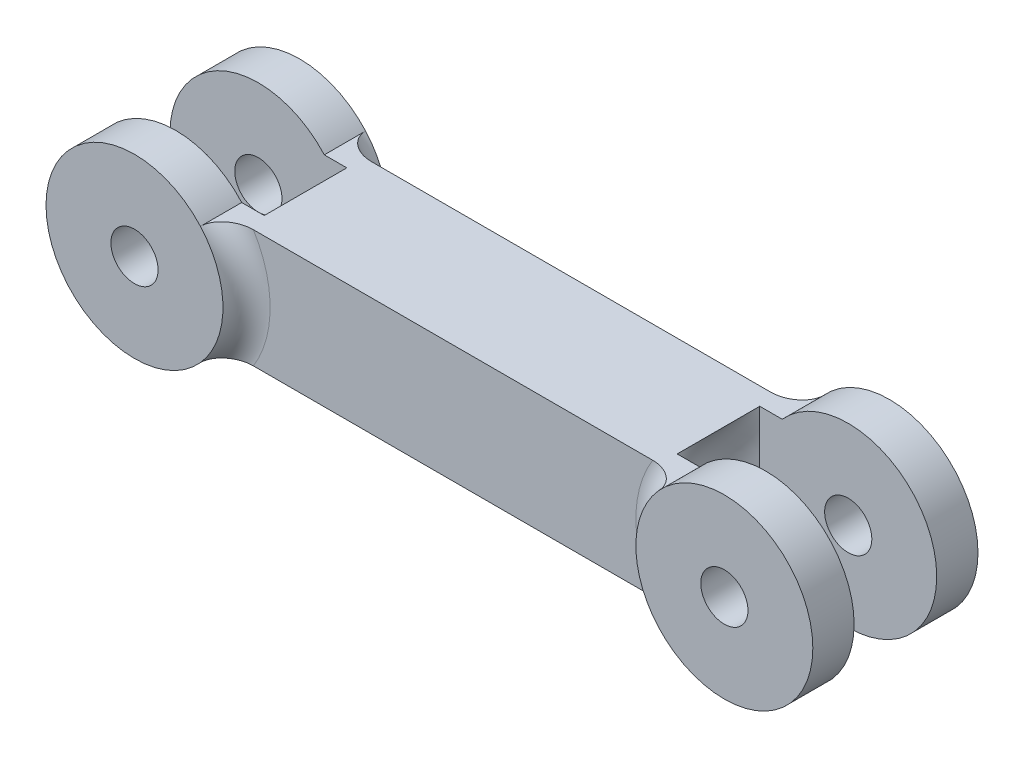
ISO-10303-21;
HEADER;
FILE_DESCRIPTION(('STEP AP214'),'2;1');
FILE_NAME('part.step','',(''),(''),'','','');
FILE_SCHEMA(('AUTOMOTIVE_DESIGN { 1 0 10303 214 1 1 1 1 }'));
ENDSEC;
DATA;
#1=APPLICATION_CONTEXT('core data for automotive mechanical design processes');
#2=APPLICATION_PROTOCOL_DEFINITION('international standard','automotive_design',2000,#1);
#3=PRODUCT_CONTEXT('',#1,'mechanical');
#4=PRODUCT('Part','Part','',(#3));
#5=PRODUCT_RELATED_PRODUCT_CATEGORY('part','',(#4));
#6=PRODUCT_DEFINITION_FORMATION('','',#4);
#7=PRODUCT_DEFINITION_CONTEXT('part definition',#1,'design');
#8=PRODUCT_DEFINITION('design','',#6,#7);
#9=PRODUCT_DEFINITION_SHAPE('','',#8);
#10=(LENGTH_UNIT() NAMED_UNIT(*) SI_UNIT(.MILLI.,.METRE.));
#11=(NAMED_UNIT(*) PLANE_ANGLE_UNIT() SI_UNIT($,.RADIAN.));
#12=(NAMED_UNIT(*) SI_UNIT($,.STERADIAN.) SOLID_ANGLE_UNIT());
#13=UNCERTAINTY_MEASURE_WITH_UNIT(LENGTH_MEASURE(1.E-05),#10,'distance_accuracy_value','');
#14=(GEOMETRIC_REPRESENTATION_CONTEXT(3) GLOBAL_UNCERTAINTY_ASSIGNED_CONTEXT((#13)) GLOBAL_UNIT_ASSIGNED_CONTEXT((#10,
#11,#12)) REPRESENTATION_CONTEXT('',''));
#15=CARTESIAN_POINT('',(0.,0.,0.));
#16=DIRECTION('',(0.,0.,1.));
#17=DIRECTION('',(1.,0.,0.));
#18=AXIS2_PLACEMENT_3D('',#15,#16,#17);
#19=CARTESIAN_POINT('',(12.5,0.,3.5));
#20=DIRECTION('',(0.,0.,-1.));
#21=DIRECTION('',(-1.,0.,0.));
#22=AXIS2_PLACEMENT_3D('',#19,#20,#21);
#23=CYLINDRICAL_SURFACE('',#22,3.75);
#24=DIRECTION('',(0.,0.,-1.));
#25=VECTOR('',#24,1.);
#26=CARTESIAN_POINT('',(9.70491502812526,-2.5,3.5));
#27=LINE('',#26,#25);
#28=CARTESIAN_POINT('',(9.70491502812526,-2.5,-1.75));
#29=VERTEX_POINT('',#28);
#30=CARTESIAN_POINT('',(9.70491502812526,-2.5,-3.5));
#31=VERTEX_POINT('',#30);
#32=EDGE_CURVE('E127',#29,#31,#27,.T.);
#33=ORIENTED_EDGE('',*,*,#32,.T.);
#34=CARTESIAN_POINT('',(12.5,0.,-3.5));
#35=DIRECTION('',(0.,0.,1.));
#36=DIRECTION('',(1.,0.,0.));
#37=AXIS2_PLACEMENT_3D('',#34,#35,#36);
#38=CIRCLE('',#37,3.75);
#39=CARTESIAN_POINT('',(9.70491502812526,2.5,-3.5));
#40=VERTEX_POINT('',#39);
#41=EDGE_CURVE('E192',#31,#40,#38,.T.);
#42=ORIENTED_EDGE('',*,*,#41,.T.);
#43=DIRECTION('',(0.,0.,-1.));
#44=VECTOR('',#43,1.);
#45=CARTESIAN_POINT('',(9.70491502812526,2.5,3.5));
#46=LINE('',#45,#44);
#47=CARTESIAN_POINT('',(9.70491502812526,2.5,-1.75));
#48=VERTEX_POINT('',#47);
#49=EDGE_CURVE('E204',#40,#48,#46,.F.);
#50=ORIENTED_EDGE('',*,*,#49,.T.);
#51=CARTESIAN_POINT('',(12.5,0.,-1.75));
#52=DIRECTION('',(0.,0.,-1.));
#53=DIRECTION('',(-1.,0.,0.));
#54=AXIS2_PLACEMENT_3D('',#51,#52,#53);
#55=CIRCLE('',#54,3.75);
#56=EDGE_CURVE('E128',#48,#29,#55,.T.);
#57=ORIENTED_EDGE('',*,*,#56,.T.);
#58=EDGE_LOOP('',(#33,#42,#50,#57));
#59=FACE_BOUND('',#58,.T.);
#60=ADVANCED_FACE('F49',(#59),#23,.T.);
#61=CARTESIAN_POINT('',(-12.5,0.,3.5));
#62=DIRECTION('',(0.,0.,-1.));
#63=DIRECTION('',(-1.,0.,0.));
#64=AXIS2_PLACEMENT_3D('',#61,#62,#63);
#65=CYLINDRICAL_SURFACE('',#64,3.75);
#66=CARTESIAN_POINT('',(-12.5,0.,3.5));
#67=DIRECTION('',(0.,0.,1.));
#68=DIRECTION('',(1.,0.,0.));
#69=AXIS2_PLACEMENT_3D('',#66,#67,#68);
#70=CIRCLE('',#69,3.75);
#71=CARTESIAN_POINT('',(-9.70491502812526,2.5,3.5));
#72=VERTEX_POINT('',#71);
#73=CARTESIAN_POINT('',(-9.70491502812526,-2.5,3.5));
#74=VERTEX_POINT('',#73);
#75=EDGE_CURVE('E178',#72,#74,#70,.T.);
#76=ORIENTED_EDGE('',*,*,#75,.F.);
#77=DIRECTION('',(0.,0.,-1.));
#78=VECTOR('',#77,1.);
#79=CARTESIAN_POINT('',(-9.70491502812526,2.5,3.5));
#80=LINE('',#79,#78);
#81=CARTESIAN_POINT('',(-9.70491502812526,2.5,1.75));
#82=VERTEX_POINT('',#81);
#83=EDGE_CURVE('E189',#72,#82,#80,.T.);
#84=ORIENTED_EDGE('',*,*,#83,.T.);
#85=CARTESIAN_POINT('',(-12.5,0.,1.75));
#86=DIRECTION('',(0.,0.,1.));
#87=DIRECTION('',(1.,0.,0.));
#88=AXIS2_PLACEMENT_3D('',#85,#86,#87);
#89=CIRCLE('',#88,3.75);
#90=CARTESIAN_POINT('',(-9.70491502812526,-2.5,1.75));
#91=VERTEX_POINT('',#90);
#92=EDGE_CURVE('E155',#82,#91,#89,.T.);
#93=ORIENTED_EDGE('',*,*,#92,.T.);
#94=DIRECTION('',(0.,0.,-1.));
#95=VECTOR('',#94,1.);
#96=CARTESIAN_POINT('',(-9.70491502812526,-2.5,3.5));
#97=LINE('',#96,#95);
#98=EDGE_CURVE('E70',#91,#74,#97,.F.);
#99=ORIENTED_EDGE('',*,*,#98,.T.);
#100=EDGE_LOOP('',(#76,#84,#93,#99));
#101=FACE_BOUND('',#100,.T.);
#102=ADVANCED_FACE('F339',(#101),#65,.T.);
#103=CARTESIAN_POINT('',(-12.5,0.,-3.5));
#104=DIRECTION('',(0.,0.,1.));
#105=DIRECTION('',(1.,0.,0.));
#106=AXIS2_PLACEMENT_3D('',#103,#104,#105);
#107=CYLINDRICAL_SURFACE('',#106,1.);
#108=CARTESIAN_POINT('',(-12.5,0.,1.75));
#109=DIRECTION('',(0.,0.,1.));
#110=DIRECTION('',(1.,0.,0.));
#111=AXIS2_PLACEMENT_3D('',#108,#109,#110);
#112=CIRCLE('',#111,1.);
#113=CARTESIAN_POINT('',(-11.5,0.,1.75));
#114=VERTEX_POINT('',#113);
#115=EDGE_CURVE('E154',#114,#114,#112,.F.);
#116=ORIENTED_EDGE('',*,*,#115,.T.);
#117=EDGE_LOOP('',(#116));
#118=FACE_BOUND('',#117,.T.);
#119=CARTESIAN_POINT('',(-12.5,0.,3.5));
#120=DIRECTION('',(0.,0.,1.));
#121=DIRECTION('',(1.,0.,0.));
#122=AXIS2_PLACEMENT_3D('',#119,#120,#121);
#123=CIRCLE('',#122,1.);
#124=CARTESIAN_POINT('',(-11.5,0.,3.5));
#125=VERTEX_POINT('',#124);
#126=EDGE_CURVE('E168',#125,#125,#123,.T.);
#127=ORIENTED_EDGE('',*,*,#126,.T.);
#128=EDGE_LOOP('',(#127));
#129=FACE_BOUND('',#128,.T.);
#130=ADVANCED_FACE('F346',(#118,#129),#107,.F.);
#131=CARTESIAN_POINT('',(12.5,0.,-3.5));
#132=DIRECTION('',(0.,0.,1.));
#133=DIRECTION('',(1.,0.,0.));
#134=AXIS2_PLACEMENT_3D('',#131,#132,#133);
#135=CYLINDRICAL_SURFACE('',#134,1.);
#136=CARTESIAN_POINT('',(12.5,0.,1.75));
#137=DIRECTION('',(0.,0.,1.));
#138=DIRECTION('',(1.,0.,0.));
#139=AXIS2_PLACEMENT_3D('',#136,#137,#138);
#140=CIRCLE('',#139,1.);
#141=CARTESIAN_POINT('',(13.5,0.,1.75));
#142=VERTEX_POINT('',#141);
#143=EDGE_CURVE('E130',#142,#142,#140,.F.);
#144=ORIENTED_EDGE('',*,*,#143,.T.);
#145=EDGE_LOOP('',(#144));
#146=FACE_BOUND('',#145,.T.);
#147=CARTESIAN_POINT('',(12.5,0.,3.5));
#148=DIRECTION('',(0.,0.,1.));
#149=DIRECTION('',(1.,0.,0.));
#150=AXIS2_PLACEMENT_3D('',#147,#148,#149);
#151=CIRCLE('',#150,1.);
#152=CARTESIAN_POINT('',(13.5,0.,3.5));
#153=VERTEX_POINT('',#152);
#154=EDGE_CURVE('E174',#153,#153,#151,.T.);
#155=ORIENTED_EDGE('',*,*,#154,.T.);
#156=EDGE_LOOP('',(#155));
#157=FACE_BOUND('',#156,.T.);
#158=ADVANCED_FACE('F482',(#146,#157),#135,.F.);
#159=CARTESIAN_POINT('',(-12.5,2.5,2.5));
#160=DIRECTION('',(0.,-1.,0.));
#161=DIRECTION('',(0.,0.,-1.));
#162=AXIS2_PLACEMENT_3D('',#159,#160,#161);
#163=PLANE('',#162);
#164=DIRECTION('',(0.,0.,1.));
#165=VECTOR('',#164,1.);
#166=CARTESIAN_POINT('',(-8.75,2.5,2.5));
#167=LINE('',#166,#165);
#168=CARTESIAN_POINT('',(-8.75,2.5,-1.75));
#169=VERTEX_POINT('',#168);
#170=CARTESIAN_POINT('',(-8.75,2.5,1.75));
#171=VERTEX_POINT('',#170);
#172=EDGE_CURVE('E177',#169,#171,#167,.T.);
#173=ORIENTED_EDGE('',*,*,#172,.T.);
#174=DIRECTION('',(-1.,0.,0.));
#175=VECTOR('',#174,1.);
#176=CARTESIAN_POINT('',(-12.5,2.5,1.75));
#177=LINE('',#176,#175);
#178=EDGE_CURVE('E160',#171,#82,#177,.T.);
#179=ORIENTED_EDGE('',*,*,#178,.T.);
#180=ORIENTED_EDGE('',*,*,#83,.F.);
#181=CARTESIAN_POINT('',(-9.70491502812526,2.5,3.5));
#182=CARTESIAN_POINT('',(-9.7049200725292,2.5,3.47644730100022));
#183=CARTESIAN_POINT('',(-9.70379770234874,2.5,3.45290917372818));
#184=CARTESIAN_POINT('',(-9.69935465653177,2.5,3.40606053403174));
#185=CARTESIAN_POINT('',(-9.69603581450327,2.5,3.38274984819653));
#186=CARTESIAN_POINT('',(-9.68294941285069,2.5,3.31383452382514));
#187=CARTESIAN_POINT('',(-9.67004959038108,2.5,3.26879466332894));
#188=CARTESIAN_POINT('',(-9.63693837940047,2.5,3.18172089404509));
#189=CARTESIAN_POINT('',(-9.61674904959208,2.5,3.13967836983396));
#190=CARTESIAN_POINT('',(-9.57024570996258,2.5,3.05903705578245));
#191=CARTESIAN_POINT('',(-9.54391622872179,2.5,3.02044731159249));
#192=CARTESIAN_POINT('',(-9.4751120244116,2.5,2.93292601600958));
#193=CARTESIAN_POINT('',(-9.43033891954086,2.5,2.88580145921302));
#194=CARTESIAN_POINT('',(-9.33377526194016,2.5,2.7994301368489));
#195=CARTESIAN_POINT('',(-9.28197600984906,2.5,2.7601932892686));
#196=CARTESIAN_POINT('',(-9.17230729582027,2.5,2.68914182985251));
#197=CARTESIAN_POINT('',(-9.11435070175242,2.5,2.65746252677132));
#198=CARTESIAN_POINT('',(-8.99462708060846,2.5,2.60254570651114));
#199=CARTESIAN_POINT('',(-8.93286188766615,2.5,2.57930416247449));
#200=CARTESIAN_POINT('',(-8.80361932096866,2.5,2.54053482631346));
#201=CARTESIAN_POINT('',(-8.7360104502717,2.5,2.52544364825104));
#202=CARTESIAN_POINT('',(-8.59932072305916,2.5,2.50518057644539));
#203=CARTESIAN_POINT('',(-8.53023973607571,2.5,2.50000956561532));
#204=CARTESIAN_POINT('',(-8.46112639464912,2.5,2.5));
#205=B_SPLINE_CURVE_WITH_KNOTS('',3,(#181,#182,#183,#184,#185,#186,#187,#188,#189,#190,#191,
#192,#193,#194,#195,#196,#197,#198,#199,#200,#201,#202,#203,#204),.UNSPECIFIED.,.F.,.F.,(4,2,2,
2,2,2,2,2,2,2,2,4),(0.,0.0706039500021436,0.141149034261344,0.280904415255709,0.420240380571201,
0.559931300120389,0.753894629336221,0.94810034275378,1.14555851100565,1.34292231955389,
1.5500129632788,1.75712203759743),.UNSPECIFIED.);
#206=CARTESIAN_POINT('',(-8.46112639464912,2.5,2.5));
#207=VERTEX_POINT('',#206);
#208=EDGE_CURVE('E61',#72,#207,#205,.T.);
#209=ORIENTED_EDGE('',*,*,#208,.T.);
#210=DIRECTION('',(-1.,0.,0.));
#211=VECTOR('',#210,1.);
#212=CARTESIAN_POINT('',(-12.5,2.5,2.5));
#213=LINE('',#212,#211);
#214=CARTESIAN_POINT('',(8.46112639464912,2.5,2.5));
#215=VERTEX_POINT('',#214);
#216=EDGE_CURVE('E208',#215,#207,#213,.T.);
#217=ORIENTED_EDGE('',*,*,#216,.F.);
#218=CARTESIAN_POINT('',(8.46112639464912,2.5,2.5));
#219=CARTESIAN_POINT('',(8.54611014179282,2.5,2.50002523424209));
#220=CARTESIAN_POINT('',(8.63104836721201,2.5,2.50783483651043));
#221=CARTESIAN_POINT('',(8.79860407903754,2.5,2.53838944765819));
#222=CARTESIAN_POINT('',(8.88120917542409,2.5,2.56120259774959));
#223=CARTESIAN_POINT('',(9.03633380801774,2.5,2.61935263187054));
#224=CARTESIAN_POINT('',(9.10916082110134,2.5,2.65387221392362));
#225=CARTESIAN_POINT('',(9.2475113940083,2.5,2.73522668310348));
#226=CARTESIAN_POINT('',(9.31305101407,2.5,2.78203369291169));
#227=CARTESIAN_POINT('',(9.41593492282529,2.5,2.87224432633347));
#228=CARTESIAN_POINT('',(9.45592169672022,2.5,2.91264513788035));
#229=CARTESIAN_POINT('',(9.52897354659569,2.5,2.99930876400299));
#230=CARTESIAN_POINT('',(9.56204774586768,2.5,3.04556372101491));
#231=CARTESIAN_POINT('',(9.61396603862031,2.5,3.13431165020416));
#232=CARTESIAN_POINT('',(9.63430957398898,2.5,3.17592521856731));
#233=CARTESIAN_POINT('',(9.66780244728371,2.5,3.26192459797803));
#234=CARTESIAN_POINT('',(9.68096756829799,2.5,3.306304086085));
#235=CARTESIAN_POINT('',(9.69496332500858,2.5,3.37589627639452));
#236=CARTESIAN_POINT('',(9.69868188505814,2.5,3.40055343305325));
#237=CARTESIAN_POINT('',(9.70366231230621,2.5,3.45013478340853));
#238=CARTESIAN_POINT('',(9.70492210894404,2.5,3.47505918441327));
#239=CARTESIAN_POINT('',(9.70491502812526,2.5,3.5));
#240=B_SPLINE_CURVE_WITH_KNOTS('',3,(#218,#219,#220,#221,#222,#223,#224,#225,#226,#227,#228,
#229,#230,#231,#232,#233,#234,#235,#236,#237,#238,#239),.UNSPECIFIED.,.F.,.F.,(4,2,2,2,2,2,2,2,
2,2,4),(0.,0.254556907092154,0.510277987085597,0.75092851467693,0.991037711216968,
1.16097838251742,1.33069332780772,1.46910913779057,1.60721937475569,1.68191662716488,
1.75667675612865),.UNSPECIFIED.);
#241=CARTESIAN_POINT('',(9.70491502812526,2.5,3.5));
#242=VERTEX_POINT('',#241);
#243=EDGE_CURVE('E248',#215,#242,#240,.T.);
#244=ORIENTED_EDGE('',*,*,#243,.T.);
#245=CARTESIAN_POINT('',(9.70491502812526,2.5,1.75));
#246=VERTEX_POINT('',#245);
#247=EDGE_CURVE('E203',#246,#242,#46,.F.);
#248=ORIENTED_EDGE('',*,*,#247,.F.);
#249=DIRECTION('',(-1.,0.,0.));
#250=VECTOR('',#249,1.);
#251=CARTESIAN_POINT('',(-12.5,2.5,1.75));
#252=LINE('',#251,#250);
#253=CARTESIAN_POINT('',(8.75,2.5,1.75));
#254=VERTEX_POINT('',#253);
#255=EDGE_CURVE('E139',#246,#254,#252,.T.);
#256=ORIENTED_EDGE('',*,*,#255,.T.);
#257=DIRECTION('',(0.,0.,-1.));
#258=VECTOR('',#257,1.);
#259=CARTESIAN_POINT('',(8.75,2.5,2.5));
#260=LINE('',#259,#258);
#261=CARTESIAN_POINT('',(8.75,2.5,-1.75));
#262=VERTEX_POINT('',#261);
#263=EDGE_CURVE('E163',#254,#262,#260,.T.);
#264=ORIENTED_EDGE('',*,*,#263,.T.);
#265=DIRECTION('',(1.,0.,0.));
#266=VECTOR('',#265,1.);
#267=CARTESIAN_POINT('',(-12.5,2.5,-1.75));
#268=LINE('',#267,#266);
#269=EDGE_CURVE('E123',#262,#48,#268,.T.);
#270=ORIENTED_EDGE('',*,*,#269,.T.);
#271=ORIENTED_EDGE('',*,*,#49,.F.);
#272=CARTESIAN_POINT('',(9.70491502812526,2.5,-3.5));
#273=CARTESIAN_POINT('',(9.7049200725292,2.5,-3.47644730100022));
#274=CARTESIAN_POINT('',(9.70379770234874,2.5,-3.45290917372818));
#275=CARTESIAN_POINT('',(9.69935465653177,2.5,-3.40606053403174));
#276=CARTESIAN_POINT('',(9.69603581450327,2.5,-3.38274984819653));
#277=CARTESIAN_POINT('',(9.68294941285069,2.5,-3.31383452382514));
#278=CARTESIAN_POINT('',(9.67004959038108,2.5,-3.26879466332894));
#279=CARTESIAN_POINT('',(9.63693837940047,2.5,-3.18172089404509));
#280=CARTESIAN_POINT('',(9.61674904959208,2.5,-3.13967836983396));
#281=CARTESIAN_POINT('',(9.57024570996258,2.5,-3.05903705578245));
#282=CARTESIAN_POINT('',(9.54391622872179,2.5,-3.02044731159249));
#283=CARTESIAN_POINT('',(9.4751120244116,2.5,-2.93292601600958));
#284=CARTESIAN_POINT('',(9.43033891954086,2.5,-2.88580145921302));
#285=CARTESIAN_POINT('',(9.33377526194016,2.5,-2.7994301368489));
#286=CARTESIAN_POINT('',(9.28197600984906,2.5,-2.7601932892686));
#287=CARTESIAN_POINT('',(9.17230729582027,2.5,-2.68914182985251));
#288=CARTESIAN_POINT('',(9.11435070175242,2.5,-2.65746252677132));
#289=CARTESIAN_POINT('',(8.99462708060846,2.5,-2.60254570651114));
#290=CARTESIAN_POINT('',(8.93286188766615,2.5,-2.57930416247449));
#291=CARTESIAN_POINT('',(8.80361932096866,2.5,-2.54053482631346));
#292=CARTESIAN_POINT('',(8.7360104502717,2.5,-2.52544364825104));
#293=CARTESIAN_POINT('',(8.59932072305916,2.5,-2.50518057644539));
#294=CARTESIAN_POINT('',(8.53023973607571,2.5,-2.50000956561532));
#295=CARTESIAN_POINT('',(8.46112639464912,2.5,-2.5));
#296=B_SPLINE_CURVE_WITH_KNOTS('',3,(#272,#273,#274,#275,#276,#277,#278,#279,#280,#281,#282,
#283,#284,#285,#286,#287,#288,#289,#290,#291,#292,#293,#294,#295),.UNSPECIFIED.,.F.,.F.,(4,2,2,
2,2,2,2,2,2,2,2,4),(0.,0.0706039500021436,0.141149034261344,0.280904415255709,0.420240380571201,
0.559931300120389,0.753894629336221,0.94810034275378,1.14555851100565,1.34292231955389,
1.5500129632788,1.75712203759743),.UNSPECIFIED.);
#297=CARTESIAN_POINT('',(8.46112639464912,2.5,-2.5));
#298=VERTEX_POINT('',#297);
#299=EDGE_CURVE('E281',#40,#298,#296,.T.);
#300=ORIENTED_EDGE('',*,*,#299,.T.);
#301=DIRECTION('',(-1.,0.,0.));
#302=VECTOR('',#301,1.);
#303=CARTESIAN_POINT('',(-12.5,2.5,-2.5));
#304=LINE('',#303,#302);
#305=CARTESIAN_POINT('',(-8.46112639464912,2.5,-2.5));
#306=VERTEX_POINT('',#305);
#307=EDGE_CURVE('E207',#298,#306,#304,.T.);
#308=ORIENTED_EDGE('',*,*,#307,.T.);
#309=CARTESIAN_POINT('',(-8.46112639464912,2.5,-2.5));
#310=CARTESIAN_POINT('',(-8.54611014179282,2.5,-2.50002523424209));
#311=CARTESIAN_POINT('',(-8.63104836721201,2.5,-2.50783483651043));
#312=CARTESIAN_POINT('',(-8.79860407903754,2.5,-2.53838944765819));
#313=CARTESIAN_POINT('',(-8.88120917542409,2.5,-2.56120259774959));
#314=CARTESIAN_POINT('',(-9.03633380801774,2.5,-2.61935263187054));
#315=CARTESIAN_POINT('',(-9.10916082110134,2.5,-2.65387221392362));
#316=CARTESIAN_POINT('',(-9.2475113940083,2.5,-2.73522668310348));
#317=CARTESIAN_POINT('',(-9.31305101407,2.5,-2.78203369291169));
#318=CARTESIAN_POINT('',(-9.41593492282529,2.5,-2.87224432633347));
#319=CARTESIAN_POINT('',(-9.45592169672022,2.5,-2.91264513788035));
#320=CARTESIAN_POINT('',(-9.52897354659569,2.5,-2.99930876400299));
#321=CARTESIAN_POINT('',(-9.56204774586768,2.5,-3.04556372101491));
#322=CARTESIAN_POINT('',(-9.61396603862031,2.5,-3.13431165020416));
#323=CARTESIAN_POINT('',(-9.63430957398898,2.5,-3.17592521856731));
#324=CARTESIAN_POINT('',(-9.66780244728371,2.5,-3.26192459797803));
#325=CARTESIAN_POINT('',(-9.68096756829799,2.5,-3.306304086085));
#326=CARTESIAN_POINT('',(-9.69496332500858,2.5,-3.37589627639452));
#327=CARTESIAN_POINT('',(-9.69868188505814,2.5,-3.40055343305325));
#328=CARTESIAN_POINT('',(-9.70366231230621,2.5,-3.45013478340853));
#329=CARTESIAN_POINT('',(-9.70492210894404,2.5,-3.47505918441327));
#330=CARTESIAN_POINT('',(-9.70491502812526,2.5,-3.5));
#331=B_SPLINE_CURVE_WITH_KNOTS('',3,(#309,#310,#311,#312,#313,#314,#315,#316,#317,#318,#319,
#320,#321,#322,#323,#324,#325,#326,#327,#328,#329,#330),.UNSPECIFIED.,.F.,.F.,(4,2,2,2,2,2,2,2,
2,2,4),(0.,0.254556907092154,0.510277987085597,0.75092851467693,0.991037711216968,
1.16097838251742,1.33069332780772,1.46910913779057,1.60721937475569,1.68191662716488,
1.75667675612865),.UNSPECIFIED.);
#332=CARTESIAN_POINT('',(-9.70491502812526,2.5,-3.5));
#333=VERTEX_POINT('',#332);
#334=EDGE_CURVE('E288',#306,#333,#331,.T.);
#335=ORIENTED_EDGE('',*,*,#334,.T.);
#336=CARTESIAN_POINT('',(-9.70491502812526,2.5,-1.75));
#337=VERTEX_POINT('',#336);
#338=EDGE_CURVE('E188',#337,#333,#80,.T.);
#339=ORIENTED_EDGE('',*,*,#338,.F.);
#340=DIRECTION('',(1.,0.,0.));
#341=VECTOR('',#340,1.);
#342=CARTESIAN_POINT('',(-12.5,2.5,-1.75));
#343=LINE('',#342,#341);
#344=EDGE_CURVE('E148',#337,#169,#343,.T.);
#345=ORIENTED_EDGE('',*,*,#344,.T.);
#346=EDGE_LOOP('',(#173,#179,#180,#209,#217,#244,#248,#256,#264,#270,#271,#300,#308,#335,#339,#345));
#347=FACE_BOUND('',#346,.T.);
#348=ADVANCED_FACE('F264',(#347),#163,.F.);
#349=CARTESIAN_POINT('',(-12.5,-2.5,2.5));
#350=DIRECTION('',(0.,1.,0.));
#351=DIRECTION('',(0.,0.,1.));
#352=AXIS2_PLACEMENT_3D('',#349,#350,#351);
#353=PLANE('',#352);
#354=ORIENTED_EDGE('',*,*,#98,.F.);
#355=DIRECTION('',(1.,0.,0.));
#356=VECTOR('',#355,1.);
#357=CARTESIAN_POINT('',(-12.5,-2.5,1.75));
#358=LINE('',#357,#356);
#359=CARTESIAN_POINT('',(-8.75,-2.5,1.75));
#360=VERTEX_POINT('',#359);
#361=EDGE_CURVE('E157',#91,#360,#358,.T.);
#362=ORIENTED_EDGE('',*,*,#361,.T.);
#363=DIRECTION('',(0.,0.,-1.));
#364=VECTOR('',#363,1.);
#365=CARTESIAN_POINT('',(-8.75,-2.5,2.5));
#366=LINE('',#365,#364);
#367=CARTESIAN_POINT('',(-8.75,-2.5,-1.75));
#368=VERTEX_POINT('',#367);
#369=EDGE_CURVE('E113',#360,#368,#366,.T.);
#370=ORIENTED_EDGE('',*,*,#369,.T.);
#371=DIRECTION('',(-1.,0.,0.));
#372=VECTOR('',#371,1.);
#373=CARTESIAN_POINT('',(-12.5,-2.5,-1.75));
#374=LINE('',#373,#372);
#375=CARTESIAN_POINT('',(-9.70491502812526,-2.5,-1.75));
#376=VERTEX_POINT('',#375);
#377=EDGE_CURVE('E149',#368,#376,#374,.T.);
#378=ORIENTED_EDGE('',*,*,#377,.T.);
#379=CARTESIAN_POINT('',(-9.70491502812526,-2.5,-3.5));
#380=VERTEX_POINT('',#379);
#381=EDGE_CURVE('E185',#380,#376,#97,.F.);
#382=ORIENTED_EDGE('',*,*,#381,.F.);
#383=CARTESIAN_POINT('',(-9.70491502812526,-2.5,-3.5));
#384=CARTESIAN_POINT('',(-9.7049200725292,-2.5,-3.47644730100022));
#385=CARTESIAN_POINT('',(-9.70379770234874,-2.5,-3.45290917372818));
#386=CARTESIAN_POINT('',(-9.69935465653177,-2.5,-3.40606053403174));
#387=CARTESIAN_POINT('',(-9.69603581450327,-2.5,-3.38274984819653));
#388=CARTESIAN_POINT('',(-9.68294941285069,-2.5,-3.31383452382514));
#389=CARTESIAN_POINT('',(-9.67004959038108,-2.5,-3.26879466332894));
#390=CARTESIAN_POINT('',(-9.63693837940047,-2.5,-3.18172089404509));
#391=CARTESIAN_POINT('',(-9.61674904959208,-2.5,-3.13967836983396));
#392=CARTESIAN_POINT('',(-9.57024570996258,-2.5,-3.05903705578245));
#393=CARTESIAN_POINT('',(-9.54391622872179,-2.5,-3.02044731159249));
#394=CARTESIAN_POINT('',(-9.4751120244116,-2.5,-2.93292601600958));
#395=CARTESIAN_POINT('',(-9.43033891954086,-2.5,-2.88580145921302));
#396=CARTESIAN_POINT('',(-9.33377526194016,-2.5,-2.7994301368489));
#397=CARTESIAN_POINT('',(-9.28197600984906,-2.5,-2.7601932892686));
#398=CARTESIAN_POINT('',(-9.17230729582027,-2.5,-2.68914182985251));
#399=CARTESIAN_POINT('',(-9.11435070175242,-2.5,-2.65746252677132));
#400=CARTESIAN_POINT('',(-8.99462708060846,-2.5,-2.60254570651114));
#401=CARTESIAN_POINT('',(-8.93286188766615,-2.5,-2.57930416247449));
#402=CARTESIAN_POINT('',(-8.80361932096866,-2.5,-2.54053482631346));
#403=CARTESIAN_POINT('',(-8.7360104502717,-2.5,-2.52544364825104));
#404=CARTESIAN_POINT('',(-8.59932072305916,-2.5,-2.50518057644539));
#405=CARTESIAN_POINT('',(-8.53023973607571,-2.5,-2.50000956561532));
#406=CARTESIAN_POINT('',(-8.46112639464912,-2.5,-2.5));
#407=B_SPLINE_CURVE_WITH_KNOTS('',3,(#383,#384,#385,#386,#387,#388,#389,#390,#391,#392,#393,
#394,#395,#396,#397,#398,#399,#400,#401,#402,#403,#404,#405,#406),.UNSPECIFIED.,.F.,.F.,(4,2,2,
2,2,2,2,2,2,2,2,4),(0.,0.0706039500021436,0.141149034261344,0.280904415255709,0.420240380571201,
0.559931300120389,0.753894629336221,0.94810034275378,1.14555851100565,1.34292231955389,
1.5500129632788,1.75712203759743),.UNSPECIFIED.);
#408=CARTESIAN_POINT('',(-8.46112639464912,-2.5,-2.5));
#409=VERTEX_POINT('',#408);
#410=EDGE_CURVE('E295',#380,#409,#407,.T.);
#411=ORIENTED_EDGE('',*,*,#410,.T.);
#412=DIRECTION('',(1.,0.,0.));
#413=VECTOR('',#412,1.);
#414=CARTESIAN_POINT('',(-12.5,-2.5,-2.5));
#415=LINE('',#414,#413);
#416=CARTESIAN_POINT('',(8.46112639464912,-2.5,-2.5));
#417=VERTEX_POINT('',#416);
#418=EDGE_CURVE('E211',#409,#417,#415,.T.);
#419=ORIENTED_EDGE('',*,*,#418,.T.);
#420=CARTESIAN_POINT('',(8.46112639464912,-2.5,-2.5));
#421=CARTESIAN_POINT('',(8.54611014179282,-2.5,-2.50002523424209));
#422=CARTESIAN_POINT('',(8.63104836721201,-2.5,-2.50783483651043));
#423=CARTESIAN_POINT('',(8.79860407903754,-2.5,-2.53838944765819));
#424=CARTESIAN_POINT('',(8.88120917542409,-2.5,-2.56120259774959));
#425=CARTESIAN_POINT('',(9.03633380801774,-2.5,-2.61935263187054));
#426=CARTESIAN_POINT('',(9.10916082110134,-2.5,-2.65387221392362));
#427=CARTESIAN_POINT('',(9.2475113940083,-2.5,-2.73522668310348));
#428=CARTESIAN_POINT('',(9.31305101407,-2.5,-2.78203369291169));
#429=CARTESIAN_POINT('',(9.41593492282529,-2.5,-2.87224432633347));
#430=CARTESIAN_POINT('',(9.45592169672022,-2.5,-2.91264513788035));
#431=CARTESIAN_POINT('',(9.52897354659569,-2.5,-2.99930876400299));
#432=CARTESIAN_POINT('',(9.56204774586768,-2.5,-3.04556372101491));
#433=CARTESIAN_POINT('',(9.61396603862031,-2.5,-3.13431165020416));
#434=CARTESIAN_POINT('',(9.63430957398898,-2.5,-3.17592521856731));
#435=CARTESIAN_POINT('',(9.66780244728371,-2.5,-3.26192459797803));
#436=CARTESIAN_POINT('',(9.68096756829799,-2.5,-3.306304086085));
#437=CARTESIAN_POINT('',(9.69496332500858,-2.5,-3.37589627639452));
#438=CARTESIAN_POINT('',(9.69868188505814,-2.5,-3.40055343305325));
#439=CARTESIAN_POINT('',(9.70366231230621,-2.5,-3.45013478340853));
#440=CARTESIAN_POINT('',(9.70492210894404,-2.5,-3.47505918441327));
#441=CARTESIAN_POINT('',(9.70491502812526,-2.5,-3.5));
#442=B_SPLINE_CURVE_WITH_KNOTS('',3,(#420,#421,#422,#423,#424,#425,#426,#427,#428,#429,#430,
#431,#432,#433,#434,#435,#436,#437,#438,#439,#440,#441),.UNSPECIFIED.,.F.,.F.,(4,2,2,2,2,2,2,2,
2,2,4),(0.,0.254556907092154,0.510277987085597,0.75092851467693,0.991037711216968,
1.16097838251742,1.33069332780772,1.46910913779057,1.60721937475569,1.68191662716488,
1.75667675612865),.UNSPECIFIED.);
#443=EDGE_CURVE('E275',#417,#31,#442,.T.);
#444=ORIENTED_EDGE('',*,*,#443,.T.);
#445=ORIENTED_EDGE('',*,*,#32,.F.);
#446=DIRECTION('',(-1.,0.,0.));
#447=VECTOR('',#446,1.);
#448=CARTESIAN_POINT('',(-12.5,-2.5,-1.75));
#449=LINE('',#448,#447);
#450=CARTESIAN_POINT('',(8.75,-2.5,-1.75));
#451=VERTEX_POINT('',#450);
#452=EDGE_CURVE('E120',#29,#451,#449,.T.);
#453=ORIENTED_EDGE('',*,*,#452,.T.);
#454=DIRECTION('',(0.,0.,1.));
#455=VECTOR('',#454,1.);
#456=CARTESIAN_POINT('',(8.75,-2.5,2.5));
#457=LINE('',#456,#455);
#458=CARTESIAN_POINT('',(8.75,-2.5,1.75));
#459=VERTEX_POINT('',#458);
#460=EDGE_CURVE('E55',#451,#459,#457,.T.);
#461=ORIENTED_EDGE('',*,*,#460,.T.);
#462=DIRECTION('',(1.,0.,0.));
#463=VECTOR('',#462,1.);
#464=CARTESIAN_POINT('',(-12.5,-2.5,1.75));
#465=LINE('',#464,#463);
#466=CARTESIAN_POINT('',(9.70491502812526,-2.5,1.75));
#467=VERTEX_POINT('',#466);
#468=EDGE_CURVE('E140',#459,#467,#465,.T.);
#469=ORIENTED_EDGE('',*,*,#468,.T.);
#470=CARTESIAN_POINT('',(9.70491502812526,-2.5,3.5));
#471=VERTEX_POINT('',#470);
#472=EDGE_CURVE('E200',#471,#467,#27,.T.);
#473=ORIENTED_EDGE('',*,*,#472,.F.);
#474=CARTESIAN_POINT('',(9.70491502812526,-2.5,3.5));
#475=CARTESIAN_POINT('',(9.7049200725292,-2.5,3.47644730100022));
#476=CARTESIAN_POINT('',(9.70379770234874,-2.5,3.45290917372818));
#477=CARTESIAN_POINT('',(9.69935465653177,-2.5,3.40606053403174));
#478=CARTESIAN_POINT('',(9.69603581450327,-2.5,3.38274984819653));
#479=CARTESIAN_POINT('',(9.68294941285069,-2.5,3.31383452382514));
#480=CARTESIAN_POINT('',(9.67004959038108,-2.5,3.26879466332894));
#481=CARTESIAN_POINT('',(9.63693837940047,-2.5,3.18172089404509));
#482=CARTESIAN_POINT('',(9.61674904959208,-2.5,3.13967836983396));
#483=CARTESIAN_POINT('',(9.57024570996258,-2.5,3.05903705578245));
#484=CARTESIAN_POINT('',(9.54391622872179,-2.5,3.02044731159249));
#485=CARTESIAN_POINT('',(9.4751120244116,-2.5,2.93292601600958));
#486=CARTESIAN_POINT('',(9.43033891954086,-2.5,2.88580145921302));
#487=CARTESIAN_POINT('',(9.33377526194016,-2.5,2.7994301368489));
#488=CARTESIAN_POINT('',(9.28197600984906,-2.5,2.7601932892686));
#489=CARTESIAN_POINT('',(9.17230729582027,-2.5,2.68914182985251));
#490=CARTESIAN_POINT('',(9.11435070175242,-2.5,2.65746252677132));
#491=CARTESIAN_POINT('',(8.99462708060846,-2.5,2.60254570651114));
#492=CARTESIAN_POINT('',(8.93286188766615,-2.5,2.57930416247449));
#493=CARTESIAN_POINT('',(8.80361932096866,-2.5,2.54053482631346));
#494=CARTESIAN_POINT('',(8.7360104502717,-2.5,2.52544364825104));
#495=CARTESIAN_POINT('',(8.59932072305916,-2.5,2.50518057644539));
#496=CARTESIAN_POINT('',(8.53023973607571,-2.5,2.50000956561532));
#497=CARTESIAN_POINT('',(8.46112639464912,-2.5,2.5));
#498=B_SPLINE_CURVE_WITH_KNOTS('',3,(#474,#475,#476,#477,#478,#479,#480,#481,#482,#483,#484,
#485,#486,#487,#488,#489,#490,#491,#492,#493,#494,#495,#496,#497),.UNSPECIFIED.,.F.,.F.,(4,2,2,
2,2,2,2,2,2,2,2,4),(0.,0.0706039500021436,0.141149034261344,0.280904415255709,0.420240380571201,
0.559931300120389,0.753894629336221,0.94810034275378,1.14555851100565,1.34292231955389,
1.5500129632788,1.75712203759743),.UNSPECIFIED.);
#499=CARTESIAN_POINT('',(8.46112639464912,-2.5,2.5));
#500=VERTEX_POINT('',#499);
#501=EDGE_CURVE('E239',#471,#500,#498,.T.);
#502=ORIENTED_EDGE('',*,*,#501,.T.);
#503=DIRECTION('',(1.,0.,0.));
#504=VECTOR('',#503,1.);
#505=CARTESIAN_POINT('',(-12.5,-2.5,2.5));
#506=LINE('',#505,#504);
#507=CARTESIAN_POINT('',(-8.46112639464912,-2.5,2.5));
#508=VERTEX_POINT('',#507);
#509=EDGE_CURVE('E114',#508,#500,#506,.T.);
#510=ORIENTED_EDGE('',*,*,#509,.F.);
#511=CARTESIAN_POINT('',(-8.46112639464912,-2.5,2.5));
#512=CARTESIAN_POINT('',(-8.54611014179282,-2.5,2.50002523424209));
#513=CARTESIAN_POINT('',(-8.63104836721201,-2.5,2.50783483651043));
#514=CARTESIAN_POINT('',(-8.79860407903754,-2.5,2.53838944765819));
#515=CARTESIAN_POINT('',(-8.88120917542409,-2.5,2.56120259774959));
#516=CARTESIAN_POINT('',(-9.03633380801774,-2.5,2.61935263187054));
#517=CARTESIAN_POINT('',(-9.10916082110134,-2.5,2.65387221392362));
#518=CARTESIAN_POINT('',(-9.2475113940083,-2.5,2.73522668310348));
#519=CARTESIAN_POINT('',(-9.31305101407,-2.5,2.78203369291169));
#520=CARTESIAN_POINT('',(-9.41593492282529,-2.5,2.87224432633347));
#521=CARTESIAN_POINT('',(-9.45592169672022,-2.5,2.91264513788035));
#522=CARTESIAN_POINT('',(-9.52897354659569,-2.5,2.99930876400299));
#523=CARTESIAN_POINT('',(-9.56204774586768,-2.5,3.04556372101491));
#524=CARTESIAN_POINT('',(-9.61396603862031,-2.5,3.13431165020416));
#525=CARTESIAN_POINT('',(-9.63430957398898,-2.5,3.17592521856731));
#526=CARTESIAN_POINT('',(-9.66780244728371,-2.5,3.26192459797803));
#527=CARTESIAN_POINT('',(-9.68096756829799,-2.5,3.306304086085));
#528=CARTESIAN_POINT('',(-9.69496332500858,-2.5,3.37589627639452));
#529=CARTESIAN_POINT('',(-9.69868188505814,-2.5,3.40055343305325));
#530=CARTESIAN_POINT('',(-9.70366231230621,-2.5,3.45013478340853));
#531=CARTESIAN_POINT('',(-9.70492210894404,-2.5,3.47505918441327));
#532=CARTESIAN_POINT('',(-9.70491502812526,-2.5,3.5));
#533=B_SPLINE_CURVE_WITH_KNOTS('',3,(#511,#512,#513,#514,#515,#516,#517,#518,#519,#520,#521,
#522,#523,#524,#525,#526,#527,#528,#529,#530,#531,#532),.UNSPECIFIED.,.F.,.F.,(4,2,2,2,2,2,2,2,
2,2,4),(0.,0.254556907092154,0.510277987085597,0.75092851467693,0.991037711216968,
1.16097838251742,1.33069332780772,1.46910913779057,1.60721937475569,1.68191662716488,
1.75667675612865),.UNSPECIFIED.);
#534=EDGE_CURVE('E13',#508,#74,#533,.T.);
#535=ORIENTED_EDGE('',*,*,#534,.T.);
#536=EDGE_LOOP('',(#354,#362,#370,#378,#382,#411,#419,#444,#445,#453,#461,#469,#473,#502,#510,#535));
#537=FACE_BOUND('',#536,.T.);
#538=ADVANCED_FACE('F124',(#537),#353,.F.);
#539=CARTESIAN_POINT('',(12.5,0.,3.5));
#540=DIRECTION('',(0.,0.,1.));
#541=DIRECTION('',(1.,0.,0.));
#542=AXIS2_PLACEMENT_3D('',#539,#540,#541);
#543=CIRCLE('',#542,3.75);
#544=EDGE_CURVE('E196',#471,#242,#543,.T.);
#545=ORIENTED_EDGE('',*,*,#544,.F.);
#546=ORIENTED_EDGE('',*,*,#472,.T.);
#547=CARTESIAN_POINT('',(12.5,0.,1.75));
#548=DIRECTION('',(0.,0.,1.));
#549=DIRECTION('',(1.,0.,0.));
#550=AXIS2_PLACEMENT_3D('',#547,#548,#549);
#551=CIRCLE('',#550,3.75);
#552=EDGE_CURVE('E136',#467,#246,#551,.T.);
#553=ORIENTED_EDGE('',*,*,#552,.T.);
#554=ORIENTED_EDGE('',*,*,#247,.T.);
#555=EDGE_LOOP('',(#545,#546,#553,#554));
#556=FACE_BOUND('',#555,.T.);
#557=ADVANCED_FACE('F342',(#556),#23,.T.);
#558=CARTESIAN_POINT('',(12.5,0.,3.5));
#559=DIRECTION('',(0.,0.,1.));
#560=DIRECTION('',(1.,0.,0.));
#561=AXIS2_PLACEMENT_3D('',#558,#559,#560);
#562=PLANE('',#561);
#563=ORIENTED_EDGE('',*,*,#154,.F.);
#564=EDGE_LOOP('',(#563));
#565=FACE_BOUND('',#564,.T.);
#566=EDGE_CURVE('E193',#242,#471,#543,.T.);
#567=ORIENTED_EDGE('',*,*,#566,.T.);
#568=ORIENTED_EDGE('',*,*,#544,.T.);
#569=EDGE_LOOP('',(#567,#568));
#570=FACE_BOUND('',#569,.T.);
#571=ADVANCED_FACE('F352',(#565,#570),#562,.T.);
#572=CARTESIAN_POINT('',(12.5,0.,-3.5));
#573=DIRECTION('',(0.,0.,1.));
#574=DIRECTION('',(1.,0.,0.));
#575=AXIS2_PLACEMENT_3D('',#572,#573,#574);
#576=PLANE('',#575);
#577=CARTESIAN_POINT('',(12.5,0.,-3.5));
#578=DIRECTION('',(0.,0.,1.));
#579=DIRECTION('',(1.,0.,0.));
#580=AXIS2_PLACEMENT_3D('',#577,#578,#579);
#581=CIRCLE('',#580,1.);
#582=CARTESIAN_POINT('',(13.5,0.,-3.5));
#583=VERTEX_POINT('',#582);
#584=EDGE_CURVE('E171',#583,#583,#581,.T.);
#585=ORIENTED_EDGE('',*,*,#584,.T.);
#586=EDGE_LOOP('',(#585));
#587=FACE_BOUND('',#586,.T.);
#588=EDGE_CURVE('E197',#40,#31,#38,.T.);
#589=ORIENTED_EDGE('',*,*,#588,.F.);
#590=ORIENTED_EDGE('',*,*,#41,.F.);
#591=EDGE_LOOP('',(#589,#590));
#592=FACE_BOUND('',#591,.T.);
#593=ADVANCED_FACE('F358',(#587,#592),#576,.F.);
#594=CARTESIAN_POINT('',(0.,0.,2.5));
#595=DIRECTION('',(0.,0.,-1.));
#596=DIRECTION('',(-1.,0.,0.));
#597=AXIS2_PLACEMENT_3D('',#594,#595,#596);
#598=PLANE('',#597);
#599=ORIENTED_EDGE('',*,*,#509,.T.);
#600=CARTESIAN_POINT('',(12.5,0.,2.5));
#601=DIRECTION('',(0.,0.,-1.));
#602=DIRECTION('',(-1.,0.,0.));
#603=AXIS2_PLACEMENT_3D('',#600,#601,#602);
#604=CIRCLE('',#603,4.75);
#605=EDGE_CURVE('E230',#500,#215,#604,.T.);
#606=ORIENTED_EDGE('',*,*,#605,.T.);
#607=ORIENTED_EDGE('',*,*,#216,.T.);
#608=CARTESIAN_POINT('',(-12.5,0.,2.5));
#609=DIRECTION('',(0.,0.,-1.));
#610=DIRECTION('',(-1.,0.,0.));
#611=AXIS2_PLACEMENT_3D('',#608,#609,#610);
#612=CIRCLE('',#611,4.75);
#613=EDGE_CURVE('E227',#207,#508,#612,.T.);
#614=ORIENTED_EDGE('',*,*,#613,.T.);
#615=EDGE_LOOP('',(#599,#606,#607,#614));
#616=FACE_BOUND('',#615,.T.);
#617=ADVANCED_FACE('F459',(#616),#598,.F.);
#618=CARTESIAN_POINT('',(0.,0.,-2.5));
#619=DIRECTION('',(0.,0.,-1.));
#620=DIRECTION('',(-1.,0.,0.));
#621=AXIS2_PLACEMENT_3D('',#618,#619,#620);
#622=PLANE('',#621);
#623=ORIENTED_EDGE('',*,*,#307,.F.);
#624=CARTESIAN_POINT('',(12.5,0.,-2.5));
#625=DIRECTION('',(0.,0.,-1.));
#626=DIRECTION('',(-1.,0.,0.));
#627=AXIS2_PLACEMENT_3D('',#624,#625,#626);
#628=CIRCLE('',#627,4.75);
#629=EDGE_CURVE('E236',#298,#417,#628,.F.);
#630=ORIENTED_EDGE('',*,*,#629,.T.);
#631=ORIENTED_EDGE('',*,*,#418,.F.);
#632=CARTESIAN_POINT('',(-12.5,0.,-2.5));
#633=DIRECTION('',(0.,0.,-1.));
#634=DIRECTION('',(-1.,0.,0.));
#635=AXIS2_PLACEMENT_3D('',#632,#633,#634);
#636=CIRCLE('',#635,4.75);
#637=EDGE_CURVE('E233',#409,#306,#636,.F.);
#638=ORIENTED_EDGE('',*,*,#637,.T.);
#639=EDGE_LOOP('',(#623,#630,#631,#638));
#640=FACE_BOUND('',#639,.T.);
#641=ADVANCED_FACE('F420',(#640),#622,.T.);
#642=ORIENTED_EDGE('',*,*,#338,.T.);
#643=CARTESIAN_POINT('',(-12.5,0.,-3.5));
#644=DIRECTION('',(0.,0.,1.));
#645=DIRECTION('',(1.,0.,0.));
#646=AXIS2_PLACEMENT_3D('',#643,#644,#645);
#647=CIRCLE('',#646,3.75);
#648=EDGE_CURVE('E182',#333,#380,#647,.T.);
#649=ORIENTED_EDGE('',*,*,#648,.T.);
#650=ORIENTED_EDGE('',*,*,#381,.T.);
#651=CARTESIAN_POINT('',(-12.5,0.,-1.75));
#652=DIRECTION('',(0.,0.,-1.));
#653=DIRECTION('',(-1.,0.,0.));
#654=AXIS2_PLACEMENT_3D('',#651,#652,#653);
#655=CIRCLE('',#654,3.75);
#656=EDGE_CURVE('E145',#376,#337,#655,.T.);
#657=ORIENTED_EDGE('',*,*,#656,.T.);
#658=EDGE_LOOP('',(#642,#649,#650,#657));
#659=FACE_BOUND('',#658,.T.);
#660=ADVANCED_FACE('F348',(#659),#65,.T.);
#661=CARTESIAN_POINT('',(-12.5,0.,3.5));
#662=DIRECTION('',(0.,0.,1.));
#663=DIRECTION('',(1.,0.,0.));
#664=AXIS2_PLACEMENT_3D('',#661,#662,#663);
#665=PLANE('',#664);
#666=ORIENTED_EDGE('',*,*,#126,.F.);
#667=EDGE_LOOP('',(#666));
#668=FACE_BOUND('',#667,.T.);
#669=ORIENTED_EDGE('',*,*,#75,.T.);
#670=EDGE_CURVE('E181',#74,#72,#70,.T.);
#671=ORIENTED_EDGE('',*,*,#670,.T.);
#672=EDGE_LOOP('',(#669,#671));
#673=FACE_BOUND('',#672,.T.);
#674=ADVANCED_FACE('F454',(#668,#673),#665,.T.);
#675=CARTESIAN_POINT('',(-12.5,0.,-3.5));
#676=DIRECTION('',(0.,0.,1.));
#677=DIRECTION('',(1.,0.,0.));
#678=AXIS2_PLACEMENT_3D('',#675,#676,#677);
#679=PLANE('',#678);
#680=CARTESIAN_POINT('',(-12.5,0.,-3.5));
#681=DIRECTION('',(0.,0.,1.));
#682=DIRECTION('',(1.,0.,0.));
#683=AXIS2_PLACEMENT_3D('',#680,#681,#682);
#684=CIRCLE('',#683,1.);
#685=CARTESIAN_POINT('',(-11.5,0.,-3.5));
#686=VERTEX_POINT('',#685);
#687=EDGE_CURVE('E164',#686,#686,#684,.T.);
#688=ORIENTED_EDGE('',*,*,#687,.T.);
#689=EDGE_LOOP('',(#688));
#690=FACE_BOUND('',#689,.T.);
#691=ORIENTED_EDGE('',*,*,#648,.F.);
#692=EDGE_CURVE('E167',#380,#333,#647,.T.);
#693=ORIENTED_EDGE('',*,*,#692,.F.);
#694=EDGE_LOOP('',(#691,#693));
#695=FACE_BOUND('',#694,.T.);
#696=ADVANCED_FACE('F414',(#690,#695),#679,.F.);
#697=CARTESIAN_POINT('',(-12.5,0.,-1.75));
#698=DIRECTION('',(0.,0.,-1.));
#699=DIRECTION('',(-1.,0.,0.));
#700=AXIS2_PLACEMENT_3D('',#697,#698,#699);
#701=CIRCLE('',#700,1.);
#702=CARTESIAN_POINT('',(-13.5,0.,-1.75));
#703=VERTEX_POINT('',#702);
#704=EDGE_CURVE('E144',#703,#703,#701,.F.);
#705=ORIENTED_EDGE('',*,*,#704,.T.);
#706=EDGE_LOOP('',(#705));
#707=FACE_BOUND('',#706,.T.);
#708=ORIENTED_EDGE('',*,*,#687,.F.);
#709=EDGE_LOOP('',(#708));
#710=FACE_BOUND('',#709,.T.);
#711=ADVANCED_FACE('F475',(#707,#710),#107,.F.);
#712=CARTESIAN_POINT('',(12.5,0.,-1.75));
#713=DIRECTION('',(0.,0.,-1.));
#714=DIRECTION('',(-1.,0.,0.));
#715=AXIS2_PLACEMENT_3D('',#712,#713,#714);
#716=CIRCLE('',#715,1.);
#717=CARTESIAN_POINT('',(11.5,0.,-1.75));
#718=VERTEX_POINT('',#717);
#719=EDGE_CURVE('E133',#718,#718,#716,.F.);
#720=ORIENTED_EDGE('',*,*,#719,.T.);
#721=EDGE_LOOP('',(#720));
#722=FACE_BOUND('',#721,.T.);
#723=ORIENTED_EDGE('',*,*,#584,.F.);
#724=EDGE_LOOP('',(#723));
#725=FACE_BOUND('',#724,.T.);
#726=ADVANCED_FACE('F471',(#722,#725),#135,.F.);
#727=CARTESIAN_POINT('',(8.75,-2.5,1.75));
#728=CARTESIAN_POINT('',(8.75,-2.5,0.583333333333333));
#729=CARTESIAN_POINT('',(8.75,-2.5,-0.583333333333334));
#730=CARTESIAN_POINT('',(8.75,-2.5,-1.75));
#731=CARTESIAN_POINT('',(8.75,-0.833333333333333,1.75));
#732=CARTESIAN_POINT('',(6.97222222222223,-0.833333333333333,0.583333333333333));
#733=CARTESIAN_POINT('',(6.97222222222223,-0.833333333333333,-0.583333333333334));
#734=CARTESIAN_POINT('',(8.75,-0.833333333333333,-1.75));
#735=CARTESIAN_POINT('',(8.75,0.833333333333334,1.75));
#736=CARTESIAN_POINT('',(6.97222222222223,0.833333333333333,0.583333333333333));
#737=CARTESIAN_POINT('',(6.97222222222223,0.833333333333333,-0.583333333333334));
#738=CARTESIAN_POINT('',(8.75,0.833333333333334,-1.75));
#739=CARTESIAN_POINT('',(8.75,2.5,1.75));
#740=CARTESIAN_POINT('',(8.75,2.5,0.583333333333333));
#741=CARTESIAN_POINT('',(8.75,2.5,-0.583333333333334));
#742=CARTESIAN_POINT('',(8.75,2.5,-1.75));
#743=B_SPLINE_SURFACE_WITH_KNOTS('',3,3,((#727,#728,#729,#730),(#731,#732,#733,#734),(#735,#736,
#737,#738),(#739,#740,#741,#742)),.UNSPECIFIED.,.F.,.F.,.F.,(4,4),(4,4),(0.,1.),(0.,1.),.UNSPECIFIED.);
#744=DIRECTION('',(0.,1.,0.));
#745=VECTOR('',#744,1.);
#746=CARTESIAN_POINT('',(8.75,-3.75,1.75));
#747=LINE('',#746,#745);
#748=EDGE_CURVE('E109',#459,#254,#747,.T.);
#749=DIRECTION('',(0.,1.,0.));
#750=VECTOR('',#749,1.);
#751=CARTESIAN_POINT('',(8.75,-3.75,-1.75));
#752=LINE('',#751,#750);
#753=EDGE_CURVE('E106',#451,#262,#752,.T.);
#754=ORIENTED_EDGE('',*,*,#748,.F.);
#755=ORIENTED_EDGE('',*,*,#460,.F.);
#756=ORIENTED_EDGE('',*,*,#753,.T.);
#757=ORIENTED_EDGE('',*,*,#263,.F.);
#758=EDGE_LOOP('',(#754,#755,#756,#757));
#759=FACE_BOUND('',#758,.T.);
#760=ADVANCED_FACE('F51',(#759),#743,.F.);
#761=CARTESIAN_POINT('',(16.25,-3.75,1.75));
#762=DIRECTION('',(0.,0.,1.));
#763=DIRECTION('',(1.,0.,0.));
#764=AXIS2_PLACEMENT_3D('',#761,#762,#763);
#765=PLANE('',#764);
#766=ORIENTED_EDGE('',*,*,#143,.F.);
#767=EDGE_LOOP('',(#766));
#768=FACE_BOUND('',#767,.T.);
#769=ORIENTED_EDGE('',*,*,#552,.F.);
#770=ORIENTED_EDGE('',*,*,#468,.F.);
#771=ORIENTED_EDGE('',*,*,#748,.T.);
#772=ORIENTED_EDGE('',*,*,#255,.F.);
#773=EDGE_LOOP('',(#769,#770,#771,#772));
#774=FACE_BOUND('',#773,.T.);
#775=ADVANCED_FACE('F334',(#768,#774),#765,.F.);
#776=CARTESIAN_POINT('',(16.25,-3.75,-1.75));
#777=DIRECTION('',(0.,0.,-1.));
#778=DIRECTION('',(-1.,0.,0.));
#779=AXIS2_PLACEMENT_3D('',#776,#777,#778);
#780=PLANE('',#779);
#781=ORIENTED_EDGE('',*,*,#719,.F.);
#782=EDGE_LOOP('',(#781));
#783=FACE_BOUND('',#782,.T.);
#784=ORIENTED_EDGE('',*,*,#753,.F.);
#785=ORIENTED_EDGE('',*,*,#452,.F.);
#786=ORIENTED_EDGE('',*,*,#56,.F.);
#787=ORIENTED_EDGE('',*,*,#269,.F.);
#788=EDGE_LOOP('',(#784,#785,#786,#787));
#789=FACE_BOUND('',#788,.T.);
#790=ADVANCED_FACE('F117',(#783,#789),#780,.F.);
#791=CARTESIAN_POINT('',(-8.75,-2.5,-1.75));
#792=CARTESIAN_POINT('',(-8.75,-2.5,-0.583333333333334));
#793=CARTESIAN_POINT('',(-8.75,-2.5,0.583333333333333));
#794=CARTESIAN_POINT('',(-8.75,-2.5,1.75));
#795=CARTESIAN_POINT('',(-8.75,-0.833333333333333,-1.75));
#796=CARTESIAN_POINT('',(-6.97222222222223,-0.833333333333333,-0.583333333333334));
#797=CARTESIAN_POINT('',(-6.97222222222223,-0.833333333333333,0.583333333333332));
#798=CARTESIAN_POINT('',(-8.75,-0.833333333333333,1.75));
#799=CARTESIAN_POINT('',(-8.75,0.833333333333334,-1.75));
#800=CARTESIAN_POINT('',(-6.97222222222223,0.833333333333333,-0.583333333333334));
#801=CARTESIAN_POINT('',(-6.97222222222223,0.833333333333333,0.583333333333332));
#802=CARTESIAN_POINT('',(-8.75,0.833333333333334,1.75));
#803=CARTESIAN_POINT('',(-8.75,2.5,-1.75));
#804=CARTESIAN_POINT('',(-8.75,2.5,-0.583333333333334));
#805=CARTESIAN_POINT('',(-8.75,2.5,0.583333333333333));
#806=CARTESIAN_POINT('',(-8.75,2.5,1.75));
#807=B_SPLINE_SURFACE_WITH_KNOTS('',3,3,((#791,#792,#793,#794),(#795,#796,#797,#798),(#799,#800,
#801,#802),(#803,#804,#805,#806)),.UNSPECIFIED.,.F.,.F.,.F.,(4,4),(4,4),(0.,1.),(0.,1.),.UNSPECIFIED.);
#808=DIRECTION('',(0.,1.,0.));
#809=VECTOR('',#808,1.);
#810=CARTESIAN_POINT('',(-8.75,-3.75,-1.75));
#811=LINE('',#810,#809);
#812=EDGE_CURVE('E435',#368,#169,#811,.T.);
#813=DIRECTION('',(0.,1.,0.));
#814=VECTOR('',#813,1.);
#815=CARTESIAN_POINT('',(-8.75,-3.75,1.75));
#816=LINE('',#815,#814);
#817=EDGE_CURVE('E220',#360,#171,#816,.T.);
#818=ORIENTED_EDGE('',*,*,#812,.F.);
#819=ORIENTED_EDGE('',*,*,#369,.F.);
#820=ORIENTED_EDGE('',*,*,#817,.T.);
#821=ORIENTED_EDGE('',*,*,#172,.F.);
#822=EDGE_LOOP('',(#818,#819,#820,#821));
#823=FACE_BOUND('',#822,.T.);
#824=ADVANCED_FACE('F316',(#823),#807,.F.);
#825=CARTESIAN_POINT('',(-16.25,-3.75,1.75));
#826=DIRECTION('',(0.,0.,1.));
#827=DIRECTION('',(1.,0.,0.));
#828=AXIS2_PLACEMENT_3D('',#825,#826,#827);
#829=PLANE('',#828);
#830=ORIENTED_EDGE('',*,*,#115,.F.);
#831=EDGE_LOOP('',(#830));
#832=FACE_BOUND('',#831,.T.);
#833=ORIENTED_EDGE('',*,*,#817,.F.);
#834=ORIENTED_EDGE('',*,*,#361,.F.);
#835=ORIENTED_EDGE('',*,*,#92,.F.);
#836=ORIENTED_EDGE('',*,*,#178,.F.);
#837=EDGE_LOOP('',(#833,#834,#835,#836));
#838=FACE_BOUND('',#837,.T.);
#839=ADVANCED_FACE('F321',(#832,#838),#829,.F.);
#840=CARTESIAN_POINT('',(-16.25,-3.75,-1.75));
#841=DIRECTION('',(0.,0.,-1.));
#842=DIRECTION('',(-1.,0.,0.));
#843=AXIS2_PLACEMENT_3D('',#840,#841,#842);
#844=PLANE('',#843);
#845=ORIENTED_EDGE('',*,*,#704,.F.);
#846=EDGE_LOOP('',(#845));
#847=FACE_BOUND('',#846,.T.);
#848=ORIENTED_EDGE('',*,*,#656,.F.);
#849=ORIENTED_EDGE('',*,*,#377,.F.);
#850=ORIENTED_EDGE('',*,*,#812,.T.);
#851=ORIENTED_EDGE('',*,*,#344,.F.);
#852=EDGE_LOOP('',(#848,#849,#850,#851));
#853=FACE_BOUND('',#852,.T.);
#854=ADVANCED_FACE('F262',(#847,#853),#844,.F.);
#855=CARTESIAN_POINT('',(12.5,0.,3.5));
#856=DIRECTION('',(0.,0.,-1.));
#857=DIRECTION('',(-1.,0.,0.));
#858=AXIS2_PLACEMENT_3D('',#855,#856,#857);
#859=TOROIDAL_SURFACE('',#858,4.75,1.);
#860=ORIENTED_EDGE('',*,*,#243,.F.);
#861=ORIENTED_EDGE('',*,*,#605,.F.);
#862=ORIENTED_EDGE('',*,*,#501,.F.);
#863=ORIENTED_EDGE('',*,*,#566,.F.);
#864=EDGE_LOOP('',(#860,#861,#862,#863));
#865=FACE_BOUND('',#864,.T.);
#866=ADVANCED_FACE('F257',(#865),#859,.F.);
#867=CARTESIAN_POINT('',(12.5,0.,-3.5));
#868=DIRECTION('',(0.,0.,-1.));
#869=DIRECTION('',(-1.,0.,0.));
#870=AXIS2_PLACEMENT_3D('',#867,#868,#869);
#871=TOROIDAL_SURFACE('',#870,4.75,1.);
#872=ORIENTED_EDGE('',*,*,#299,.F.);
#873=ORIENTED_EDGE('',*,*,#588,.T.);
#874=ORIENTED_EDGE('',*,*,#443,.F.);
#875=ORIENTED_EDGE('',*,*,#629,.F.);
#876=EDGE_LOOP('',(#872,#873,#874,#875));
#877=FACE_BOUND('',#876,.T.);
#878=ADVANCED_FACE('F261',(#877),#871,.F.);
#879=CARTESIAN_POINT('',(-12.5,0.,-3.5));
#880=DIRECTION('',(0.,0.,-1.));
#881=DIRECTION('',(-1.,0.,0.));
#882=AXIS2_PLACEMENT_3D('',#879,#880,#881);
#883=TOROIDAL_SURFACE('',#882,4.75,1.);
#884=ORIENTED_EDGE('',*,*,#410,.F.);
#885=ORIENTED_EDGE('',*,*,#692,.T.);
#886=ORIENTED_EDGE('',*,*,#334,.F.);
#887=ORIENTED_EDGE('',*,*,#637,.F.);
#888=EDGE_LOOP('',(#884,#885,#886,#887));
#889=FACE_BOUND('',#888,.T.);
#890=ADVANCED_FACE('F270',(#889),#883,.F.);
#891=CARTESIAN_POINT('',(-12.5,0.,3.5));
#892=DIRECTION('',(0.,0.,-1.));
#893=DIRECTION('',(-1.,0.,0.));
#894=AXIS2_PLACEMENT_3D('',#891,#892,#893);
#895=TOROIDAL_SURFACE('',#894,4.75,1.);
#896=ORIENTED_EDGE('',*,*,#534,.F.);
#897=ORIENTED_EDGE('',*,*,#613,.F.);
#898=ORIENTED_EDGE('',*,*,#208,.F.);
#899=ORIENTED_EDGE('',*,*,#670,.F.);
#900=EDGE_LOOP('',(#896,#897,#898,#899));
#901=FACE_BOUND('',#900,.T.);
#902=ADVANCED_FACE('F312',(#901),#895,.F.);
#903=CLOSED_SHELL('',(#60,#102,#130,#158,#348,#538,#557,#571,#593,#617,#641,#660,#674,#696,#711,
#726,#760,#775,#790,#824,#839,#854,#866,#878,#890,#902));
#904=MANIFOLD_SOLID_BREP('B2',#903);
#905=ADVANCED_BREP_SHAPE_REPRESENTATION('',(#18,#904),#14);
#906=SHAPE_DEFINITION_REPRESENTATION(#9,#905);
ENDSEC;
END-ISO-10303-21;
